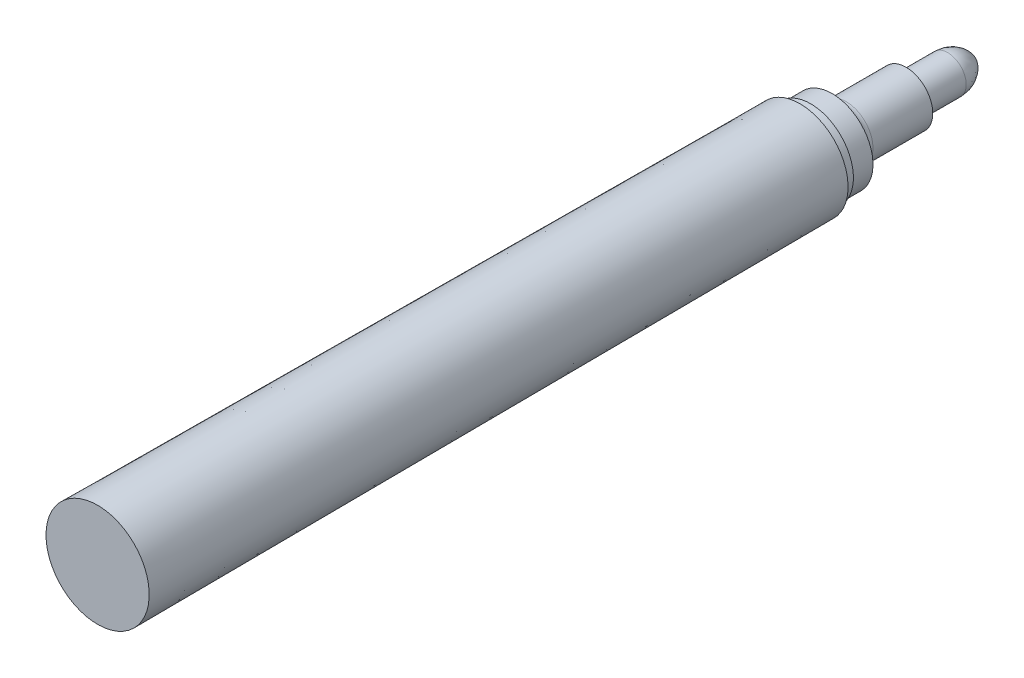
ISO-10303-21;
HEADER;
FILE_DESCRIPTION(('STEP AP214'),'2;1');
FILE_NAME('part.step','',(''),(''),'','','');
FILE_SCHEMA(('AUTOMOTIVE_DESIGN { 1 0 10303 214 1 1 1 1 }'));
ENDSEC;
DATA;
#1=APPLICATION_CONTEXT('core data for automotive mechanical design processes');
#2=APPLICATION_PROTOCOL_DEFINITION('international standard','automotive_design',2000,#1);
#3=PRODUCT_CONTEXT('',#1,'mechanical');
#4=PRODUCT('Part','Part','',(#3));
#5=PRODUCT_RELATED_PRODUCT_CATEGORY('part','',(#4));
#6=PRODUCT_DEFINITION_FORMATION('','',#4);
#7=PRODUCT_DEFINITION_CONTEXT('part definition',#1,'design');
#8=PRODUCT_DEFINITION('design','',#6,#7);
#9=PRODUCT_DEFINITION_SHAPE('','',#8);
#10=(LENGTH_UNIT() NAMED_UNIT(*) SI_UNIT(.MILLI.,.METRE.));
#11=(NAMED_UNIT(*) PLANE_ANGLE_UNIT() SI_UNIT($,.RADIAN.));
#12=(NAMED_UNIT(*) SI_UNIT($,.STERADIAN.) SOLID_ANGLE_UNIT());
#13=UNCERTAINTY_MEASURE_WITH_UNIT(LENGTH_MEASURE(1.E-05),#10,'distance_accuracy_value','');
#14=(GEOMETRIC_REPRESENTATION_CONTEXT(3) GLOBAL_UNCERTAINTY_ASSIGNED_CONTEXT((#13)) GLOBAL_UNIT_ASSIGNED_CONTEXT((#10,
#11,#12)) REPRESENTATION_CONTEXT('',''));
#15=CARTESIAN_POINT('',(0.,0.,0.));
#16=DIRECTION('',(0.,0.,1.));
#17=DIRECTION('',(1.,0.,0.));
#18=AXIS2_PLACEMENT_3D('',#15,#16,#17);
#19=CARTESIAN_POINT('',(0.,0.,0.));
#20=DIRECTION('',(0.,0.,1.));
#21=DIRECTION('',(1.,0.,0.));
#22=AXIS2_PLACEMENT_3D('',#19,#20,#21);
#23=PLANE('',#22);
#24=CARTESIAN_POINT('',(0.,0.,0.));
#25=DIRECTION('',(0.,0.,-1.));
#26=DIRECTION('',(-1.,0.,0.));
#27=AXIS2_PLACEMENT_3D('',#24,#25,#26);
#28=CIRCLE('',#27,7.25);
#29=CARTESIAN_POINT('',(-7.25,0.,0.));
#30=VERTEX_POINT('',#29);
#31=EDGE_CURVE('E46',#30,#30,#28,.T.);
#32=ORIENTED_EDGE('',*,*,#31,.F.);
#33=EDGE_LOOP('',(#32));
#34=FACE_BOUND('',#33,.T.);
#35=ADVANCED_FACE('F43',(#34),#23,.T.);
#36=CARTESIAN_POINT('',(0.,0.,-98.6987335278422));
#37=DIRECTION('',(0.,0.,1.));
#38=DIRECTION('',(1.,0.,0.));
#39=AXIS2_PLACEMENT_3D('',#36,#37,#38);
#40=CONICAL_SURFACE('',#39,6.75000000000001,0.00506587779736116);
#41=ORIENTED_EDGE('',*,*,#31,.T.);
#42=EDGE_LOOP('',(#41));
#43=FACE_BOUND('',#42,.T.);
#44=CARTESIAN_POINT('',(0.,0.,-98.6987335278422));
#45=DIRECTION('',(0.,0.,-1.));
#46=DIRECTION('',(-1.,0.,0.));
#47=AXIS2_PLACEMENT_3D('',#44,#45,#46);
#48=CIRCLE('',#47,6.75000000000001);
#49=CARTESIAN_POINT('',(-6.75000000000001,0.,-98.6987335278422));
#50=VERTEX_POINT('',#49);
#51=EDGE_CURVE('E75',#50,#50,#48,.T.);
#52=ORIENTED_EDGE('',*,*,#51,.F.);
#53=EDGE_LOOP('',(#52));
#54=FACE_BOUND('',#53,.T.);
#55=ADVANCED_FACE('F66',(#43,#54),#40,.T.);
#56=CARTESIAN_POINT('',(-6.75000000000001,0.,-98.6987335278422));
#57=DIRECTION('',(0.,0.,-1.));
#58=DIRECTION('',(-1.,0.,0.));
#59=AXIS2_PLACEMENT_3D('',#56,#57,#58);
#60=PLANE('',#59);
#61=CARTESIAN_POINT('',(0.,0.,-98.6987335278422));
#62=DIRECTION('',(0.,0.,-1.));
#63=DIRECTION('',(-1.,0.,0.));
#64=AXIS2_PLACEMENT_3D('',#61,#62,#63);
#65=CIRCLE('',#64,6.);
#66=CARTESIAN_POINT('',(-6.,0.,-98.6987335278422));
#67=VERTEX_POINT('',#66);
#68=EDGE_CURVE('E11',#67,#67,#65,.T.);
#69=ORIENTED_EDGE('',*,*,#68,.F.);
#70=EDGE_LOOP('',(#69));
#71=FACE_BOUND('',#70,.T.);
#72=ORIENTED_EDGE('',*,*,#51,.T.);
#73=EDGE_LOOP('',(#72));
#74=FACE_BOUND('',#73,.T.);
#75=ADVANCED_FACE('F71',(#71,#74),#60,.T.);
#76=CARTESIAN_POINT('',(0.,0.,-98.6987335278422));
#77=DIRECTION('',(0.,0.,-1.));
#78=DIRECTION('',(-1.,0.,0.));
#79=AXIS2_PLACEMENT_3D('',#76,#77,#78);
#80=CYLINDRICAL_SURFACE('',#79,6.);
#81=ORIENTED_EDGE('',*,*,#68,.T.);
#82=EDGE_LOOP('',(#81));
#83=FACE_BOUND('',#82,.T.);
#84=CARTESIAN_POINT('',(0.,0.,-100.198733527842));
#85=DIRECTION('',(0.,0.,-1.));
#86=DIRECTION('',(-1.,0.,0.));
#87=AXIS2_PLACEMENT_3D('',#84,#85,#86);
#88=CIRCLE('',#87,6.);
#89=CARTESIAN_POINT('',(-6.,0.,-100.198733527842));
#90=VERTEX_POINT('',#89);
#91=EDGE_CURVE('E77',#90,#90,#88,.T.);
#92=ORIENTED_EDGE('',*,*,#91,.F.);
#93=EDGE_LOOP('',(#92));
#94=FACE_BOUND('',#93,.T.);
#95=ADVANCED_FACE('F124',(#83,#94),#80,.T.);
#96=CARTESIAN_POINT('',(-6.,0.,-100.198733527842));
#97=DIRECTION('',(0.,0.,-1.));
#98=DIRECTION('',(-1.,0.,0.));
#99=AXIS2_PLACEMENT_3D('',#96,#97,#98);
#100=PLANE('',#99);
#101=ORIENTED_EDGE('',*,*,#91,.T.);
#102=EDGE_LOOP('',(#101));
#103=FACE_BOUND('',#102,.T.);
#104=CARTESIAN_POINT('',(0.,0.,-100.198733527842));
#105=DIRECTION('',(0.,0.,-1.));
#106=DIRECTION('',(-1.,0.,0.));
#107=AXIS2_PLACEMENT_3D('',#104,#105,#106);
#108=CIRCLE('',#107,5.75);
#109=CARTESIAN_POINT('',(-5.75,0.,-100.198733527842));
#110=VERTEX_POINT('',#109);
#111=EDGE_CURVE('E81',#110,#110,#108,.T.);
#112=ORIENTED_EDGE('',*,*,#111,.F.);
#113=EDGE_LOOP('',(#112));
#114=FACE_BOUND('',#113,.T.);
#115=ADVANCED_FACE('F120',(#103,#114),#100,.T.);
#116=CARTESIAN_POINT('',(0.,0.,-98.6987335278422));
#117=DIRECTION('',(0.,0.,-1.));
#118=DIRECTION('',(-1.,0.,0.));
#119=AXIS2_PLACEMENT_3D('',#116,#117,#118);
#120=CYLINDRICAL_SURFACE('',#119,5.75);
#121=ORIENTED_EDGE('',*,*,#111,.T.);
#122=EDGE_LOOP('',(#121));
#123=FACE_BOUND('',#122,.T.);
#124=CARTESIAN_POINT('',(0.,0.,-103.198733527842));
#125=DIRECTION('',(0.,0.,-1.));
#126=DIRECTION('',(-1.,0.,0.));
#127=AXIS2_PLACEMENT_3D('',#124,#125,#126);
#128=CIRCLE('',#127,5.75);
#129=CARTESIAN_POINT('',(-5.75,0.,-103.198733527842));
#130=VERTEX_POINT('',#129);
#131=EDGE_CURVE('E86',#130,#130,#128,.T.);
#132=ORIENTED_EDGE('',*,*,#131,.F.);
#133=EDGE_LOOP('',(#132));
#134=FACE_BOUND('',#133,.T.);
#135=ADVANCED_FACE('F116',(#123,#134),#120,.T.);
#136=CARTESIAN_POINT('',(0.,0.,-105.198733527842));
#137=DIRECTION('',(0.,0.,-1.));
#138=DIRECTION('',(-1.,0.,0.));
#139=AXIS2_PLACEMENT_3D('',#136,#137,#138);
#140=TOROIDAL_SURFACE('',#139,5.75,2.00000000000006);
#141=ORIENTED_EDGE('',*,*,#131,.T.);
#142=EDGE_LOOP('',(#141));
#143=FACE_BOUND('',#142,.T.);
#144=CARTESIAN_POINT('',(0.,0.,-105.198733527842));
#145=DIRECTION('',(0.,0.,-1.));
#146=DIRECTION('',(-1.,0.,0.));
#147=AXIS2_PLACEMENT_3D('',#144,#145,#146);
#148=CIRCLE('',#147,3.74999999999994);
#149=CARTESIAN_POINT('',(-3.74999999999994,0.,-105.198733527842));
#150=VERTEX_POINT('',#149);
#151=EDGE_CURVE('E89',#150,#150,#148,.T.);
#152=ORIENTED_EDGE('',*,*,#151,.F.);
#153=EDGE_LOOP('',(#152));
#154=FACE_BOUND('',#153,.T.);
#155=ADVANCED_FACE('F110',(#143,#154),#140,.F.);
#156=CARTESIAN_POINT('',(0.,0.,-98.6987335278422));
#157=DIRECTION('',(0.,0.,-1.));
#158=DIRECTION('',(-1.,0.,0.));
#159=AXIS2_PLACEMENT_3D('',#156,#157,#158);
#160=CYLINDRICAL_SURFACE('',#159,3.74999999999997);
#161=ORIENTED_EDGE('',*,*,#151,.T.);
#162=EDGE_LOOP('',(#161));
#163=FACE_BOUND('',#162,.T.);
#164=CARTESIAN_POINT('',(0.,0.,-113.598733527842));
#165=DIRECTION('',(0.,0.,-1.));
#166=DIRECTION('',(-1.,0.,0.));
#167=AXIS2_PLACEMENT_3D('',#164,#165,#166);
#168=CIRCLE('',#167,3.75);
#169=CARTESIAN_POINT('',(-3.75,0.,-113.598733527842));
#170=VERTEX_POINT('',#169);
#171=EDGE_CURVE('E92',#170,#170,#168,.T.);
#172=ORIENTED_EDGE('',*,*,#171,.F.);
#173=EDGE_LOOP('',(#172));
#174=FACE_BOUND('',#173,.T.);
#175=ADVANCED_FACE('F104',(#163,#174),#160,.T.);
#176=CARTESIAN_POINT('',(-3.75,0.,-113.598733527842));
#177=DIRECTION('',(0.,0.,-1.));
#178=DIRECTION('',(-1.,0.,0.));
#179=AXIS2_PLACEMENT_3D('',#176,#177,#178);
#180=PLANE('',#179);
#181=ORIENTED_EDGE('',*,*,#171,.T.);
#182=EDGE_LOOP('',(#181));
#183=FACE_BOUND('',#182,.T.);
#184=CARTESIAN_POINT('',(0.,0.,-113.598733527842));
#185=DIRECTION('',(0.,0.,-1.));
#186=DIRECTION('',(-1.,0.,0.));
#187=AXIS2_PLACEMENT_3D('',#184,#185,#186);
#188=CIRCLE('',#187,2.6);
#189=CARTESIAN_POINT('',(-2.6,0.,-113.598733527842));
#190=VERTEX_POINT('',#189);
#191=EDGE_CURVE('E95',#190,#190,#188,.T.);
#192=ORIENTED_EDGE('',*,*,#191,.F.);
#193=EDGE_LOOP('',(#192));
#194=FACE_BOUND('',#193,.T.);
#195=ADVANCED_FACE('F61',(#183,#194),#180,.T.);
#196=CARTESIAN_POINT('',(0.,0.,-98.6987335278422));
#197=DIRECTION('',(0.,0.,-1.));
#198=DIRECTION('',(-1.,0.,0.));
#199=AXIS2_PLACEMENT_3D('',#196,#197,#198);
#200=CYLINDRICAL_SURFACE('',#199,2.6);
#201=ORIENTED_EDGE('',*,*,#191,.T.);
#202=EDGE_LOOP('',(#201));
#203=FACE_BOUND('',#202,.T.);
#204=CARTESIAN_POINT('',(0.,0.,-119.451734728803));
#205=DIRECTION('',(0.,0.,-1.));
#206=DIRECTION('',(-1.,0.,0.));
#207=AXIS2_PLACEMENT_3D('',#204,#205,#206);
#208=CIRCLE('',#207,2.6);
#209=CARTESIAN_POINT('',(-2.6,0.,-119.451734728803));
#210=VERTEX_POINT('',#209);
#211=EDGE_CURVE('E98',#210,#210,#208,.T.);
#212=ORIENTED_EDGE('',*,*,#211,.F.);
#213=EDGE_LOOP('',(#212));
#214=FACE_BOUND('',#213,.T.);
#215=ADVANCED_FACE('F55',(#203,#214),#200,.T.);
#216=CARTESIAN_POINT('',(1.4,0.,-119.451734728803));
#217=DIRECTION('',(0.,-1.,0.));
#218=DIRECTION('',(-1.,0.,0.));
#219=AXIS2_PLACEMENT_3D('',#216,#217,#218);
#220=CIRCLE('',#219,4.);
#221=TRIMMED_CURVE('',#220,(PARAMETER_VALUE(-1.21322522314939)),
(PARAMETER_VALUE(1.21322522314939)),.T.,.PARAMETER.);
#222=CARTESIAN_POINT('',(0.,0.,-119.451734728803));
#223=DIRECTION('',(0.,0.,-1.));
#224=AXIS1_PLACEMENT('',#222,#223);
#225=SURFACE_OF_REVOLUTION('',#221,#224);
#226=ORIENTED_EDGE('',*,*,#211,.T.);
#227=EDGE_LOOP('',(#226));
#228=FACE_BOUND('',#227,.T.);
#229=CARTESIAN_POINT('',(0.,0.,-123.198733527842));
#230=VERTEX_POINT('',#229);
#231=VERTEX_LOOP('',#230);
#232=FACE_BOUND('',#231,.T.);
#233=ADVANCED_FACE('F53',(#228,#232),#225,.T.);
#234=CLOSED_SHELL('',(#35,#55,#75,#95,#115,#135,#155,#175,#195,#215,#233));
#235=MANIFOLD_SOLID_BREP('B2',#234);
#236=ADVANCED_BREP_SHAPE_REPRESENTATION('',(#18,#235),#14);
#237=SHAPE_DEFINITION_REPRESENTATION(#9,#236);
ENDSEC;
END-ISO-10303-21;
